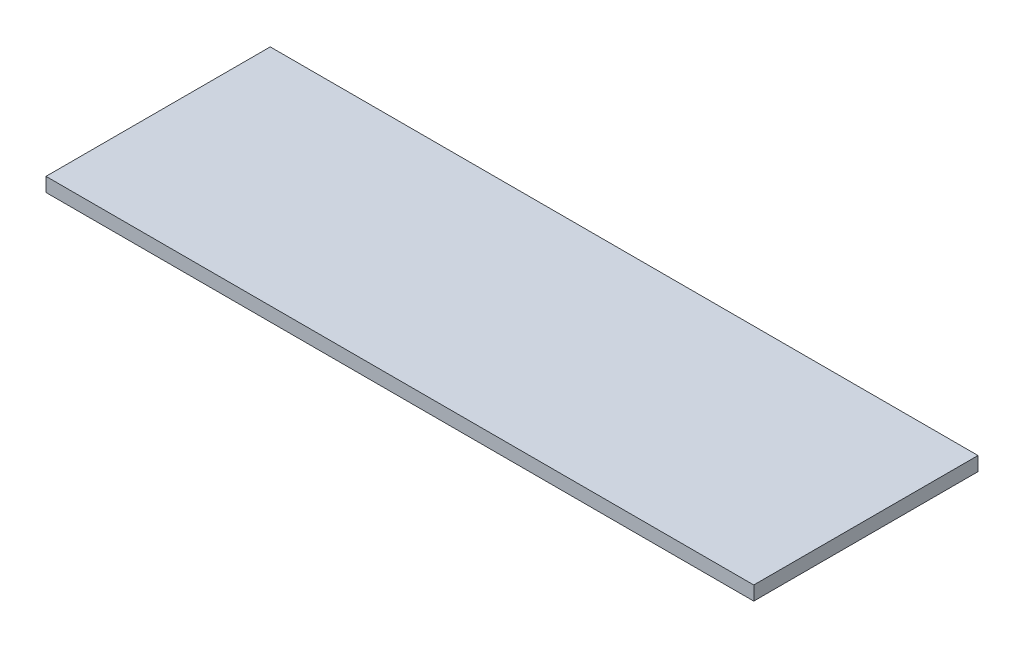
ISO-10303-21;
HEADER;
FILE_DESCRIPTION(('STEP AP214'),'2;1');
FILE_NAME('part.step','',(''),(''),'','','');
FILE_SCHEMA(('AUTOMOTIVE_DESIGN { 1 0 10303 214 1 1 1 1 }'));
ENDSEC;
DATA;
#1=APPLICATION_CONTEXT('core data for automotive mechanical design processes');
#2=APPLICATION_PROTOCOL_DEFINITION('international standard','automotive_design',2000,#1);
#3=PRODUCT_CONTEXT('',#1,'mechanical');
#4=PRODUCT('Part','Part','',(#3));
#5=PRODUCT_RELATED_PRODUCT_CATEGORY('part','',(#4));
#6=PRODUCT_DEFINITION_FORMATION('','',#4);
#7=PRODUCT_DEFINITION_CONTEXT('part definition',#1,'design');
#8=PRODUCT_DEFINITION('design','',#6,#7);
#9=PRODUCT_DEFINITION_SHAPE('','',#8);
#10=(LENGTH_UNIT() NAMED_UNIT(*) SI_UNIT(.MILLI.,.METRE.));
#11=(NAMED_UNIT(*) PLANE_ANGLE_UNIT() SI_UNIT($,.RADIAN.));
#12=(NAMED_UNIT(*) SI_UNIT($,.STERADIAN.) SOLID_ANGLE_UNIT());
#13=UNCERTAINTY_MEASURE_WITH_UNIT(LENGTH_MEASURE(1.E-05),#10,'distance_accuracy_value','');
#14=(GEOMETRIC_REPRESENTATION_CONTEXT(3) GLOBAL_UNCERTAINTY_ASSIGNED_CONTEXT((#13)) GLOBAL_UNIT_ASSIGNED_CONTEXT((#10,
#11,#12)) REPRESENTATION_CONTEXT('',''));
#15=CARTESIAN_POINT('',(0.,0.,0.));
#16=DIRECTION('',(0.,0.,1.));
#17=DIRECTION('',(1.,0.,0.));
#18=AXIS2_PLACEMENT_3D('',#15,#16,#17);
#19=CARTESIAN_POINT('',(0.,12.7,0.));
#20=DIRECTION('',(1.,0.,0.));
#21=DIRECTION('',(0.,0.,-1.));
#22=AXIS2_PLACEMENT_3D('',#19,#20,#21);
#23=PLANE('',#22);
#24=DIRECTION('',(0.,0.,1.));
#25=VECTOR('',#24,1.);
#26=CARTESIAN_POINT('',(0.,0.,0.));
#27=LINE('',#26,#25);
#28=CARTESIAN_POINT('',(0.,0.,-203.2));
#29=VERTEX_POINT('',#28);
#30=CARTESIAN_POINT('',(0.,0.,0.));
#31=VERTEX_POINT('',#30);
#32=EDGE_CURVE('E97',#29,#31,#27,.T.);
#33=ORIENTED_EDGE('',*,*,#32,.T.);
#34=DIRECTION('',(0.,-1.,0.));
#35=VECTOR('',#34,1.);
#36=CARTESIAN_POINT('',(0.,12.7,0.));
#37=LINE('',#36,#35);
#38=CARTESIAN_POINT('',(0.,12.7,0.));
#39=VERTEX_POINT('',#38);
#40=EDGE_CURVE('E11',#39,#31,#37,.T.);
#41=ORIENTED_EDGE('',*,*,#40,.F.);
#42=DIRECTION('',(0.,0.,1.));
#43=VECTOR('',#42,1.);
#44=CARTESIAN_POINT('',(0.,12.7,0.));
#45=LINE('',#44,#43);
#46=CARTESIAN_POINT('',(0.,12.7,-203.2));
#47=VERTEX_POINT('',#46);
#48=EDGE_CURVE('E85',#47,#39,#45,.T.);
#49=ORIENTED_EDGE('',*,*,#48,.F.);
#50=DIRECTION('',(0.,-1.,0.));
#51=VECTOR('',#50,1.);
#52=CARTESIAN_POINT('',(0.,12.7,-203.2));
#53=LINE('',#52,#51);
#54=EDGE_CURVE('E93',#47,#29,#53,.T.);
#55=ORIENTED_EDGE('',*,*,#54,.T.);
#56=EDGE_LOOP('',(#33,#41,#49,#55));
#57=FACE_BOUND('',#56,.T.);
#58=ADVANCED_FACE('F34',(#57),#23,.F.);
#59=CARTESIAN_POINT('',(0.,12.7,0.));
#60=DIRECTION('',(0.,0.,-1.));
#61=DIRECTION('',(-1.,0.,0.));
#62=AXIS2_PLACEMENT_3D('',#59,#60,#61);
#63=PLANE('',#62);
#64=DIRECTION('',(1.,0.,0.));
#65=VECTOR('',#64,1.);
#66=CARTESIAN_POINT('',(0.,0.,0.));
#67=LINE('',#66,#65);
#68=CARTESIAN_POINT('',(641.35,0.,0.));
#69=VERTEX_POINT('',#68);
#70=EDGE_CURVE('E89',#31,#69,#67,.T.);
#71=ORIENTED_EDGE('',*,*,#70,.T.);
#72=DIRECTION('',(0.,-1.,0.));
#73=VECTOR('',#72,1.);
#74=CARTESIAN_POINT('',(641.35,12.7,0.));
#75=LINE('',#74,#73);
#76=CARTESIAN_POINT('',(641.35,12.7,0.));
#77=VERTEX_POINT('',#76);
#78=EDGE_CURVE('E42',#77,#69,#75,.T.);
#79=ORIENTED_EDGE('',*,*,#78,.F.);
#80=DIRECTION('',(1.,0.,0.));
#81=VECTOR('',#80,1.);
#82=CARTESIAN_POINT('',(0.,12.7,0.));
#83=LINE('',#82,#81);
#84=EDGE_CURVE('E80',#39,#77,#83,.T.);
#85=ORIENTED_EDGE('',*,*,#84,.F.);
#86=ORIENTED_EDGE('',*,*,#40,.T.);
#87=EDGE_LOOP('',(#71,#79,#85,#86));
#88=FACE_BOUND('',#87,.T.);
#89=ADVANCED_FACE('F88',(#88),#63,.F.);
#90=CARTESIAN_POINT('',(641.35,12.7,0.));
#91=DIRECTION('',(-1.,0.,0.));
#92=DIRECTION('',(0.,0.,1.));
#93=AXIS2_PLACEMENT_3D('',#90,#91,#92);
#94=PLANE('',#93);
#95=DIRECTION('',(0.,0.,-1.));
#96=VECTOR('',#95,1.);
#97=CARTESIAN_POINT('',(641.35,0.,0.));
#98=LINE('',#97,#96);
#99=CARTESIAN_POINT('',(641.35,0.,-203.2));
#100=VERTEX_POINT('',#99);
#101=EDGE_CURVE('E67',#69,#100,#98,.T.);
#102=ORIENTED_EDGE('',*,*,#101,.T.);
#103=DIRECTION('',(0.,-1.,0.));
#104=VECTOR('',#103,1.);
#105=CARTESIAN_POINT('',(641.35,12.7,-203.2));
#106=LINE('',#105,#104);
#107=CARTESIAN_POINT('',(641.35,12.7,-203.2));
#108=VERTEX_POINT('',#107);
#109=EDGE_CURVE('E90',#108,#100,#106,.T.);
#110=ORIENTED_EDGE('',*,*,#109,.F.);
#111=DIRECTION('',(0.,0.,-1.));
#112=VECTOR('',#111,1.);
#113=CARTESIAN_POINT('',(641.35,12.7,0.));
#114=LINE('',#113,#112);
#115=EDGE_CURVE('E83',#77,#108,#114,.T.);
#116=ORIENTED_EDGE('',*,*,#115,.F.);
#117=ORIENTED_EDGE('',*,*,#78,.T.);
#118=EDGE_LOOP('',(#102,#110,#116,#117));
#119=FACE_BOUND('',#118,.T.);
#120=ADVANCED_FACE('F91',(#119),#94,.F.);
#121=CARTESIAN_POINT('',(0.,12.7,-203.2));
#122=DIRECTION('',(0.,0.,1.));
#123=DIRECTION('',(1.,0.,0.));
#124=AXIS2_PLACEMENT_3D('',#121,#122,#123);
#125=PLANE('',#124);
#126=DIRECTION('',(-1.,0.,0.));
#127=VECTOR('',#126,1.);
#128=CARTESIAN_POINT('',(0.,0.,-203.2));
#129=LINE('',#128,#127);
#130=EDGE_CURVE('E73',#100,#29,#129,.T.);
#131=ORIENTED_EDGE('',*,*,#130,.T.);
#132=ORIENTED_EDGE('',*,*,#54,.F.);
#133=DIRECTION('',(-1.,0.,0.));
#134=VECTOR('',#133,1.);
#135=CARTESIAN_POINT('',(0.,12.7,-203.2));
#136=LINE('',#135,#134);
#137=EDGE_CURVE('E50',#108,#47,#136,.T.);
#138=ORIENTED_EDGE('',*,*,#137,.F.);
#139=ORIENTED_EDGE('',*,*,#109,.T.);
#140=EDGE_LOOP('',(#131,#132,#138,#139));
#141=FACE_BOUND('',#140,.T.);
#142=ADVANCED_FACE('F104',(#141),#125,.F.);
#143=CARTESIAN_POINT('',(0.,12.7,0.));
#144=DIRECTION('',(0.,-1.,0.));
#145=DIRECTION('',(0.,0.,-1.));
#146=AXIS2_PLACEMENT_3D('',#143,#144,#145);
#147=PLANE('',#146);
#148=ORIENTED_EDGE('',*,*,#48,.T.);
#149=ORIENTED_EDGE('',*,*,#84,.T.);
#150=ORIENTED_EDGE('',*,*,#115,.T.);
#151=ORIENTED_EDGE('',*,*,#137,.T.);
#152=EDGE_LOOP('',(#148,#149,#150,#151));
#153=FACE_BOUND('',#152,.T.);
#154=ADVANCED_FACE('F81',(#153),#147,.F.);
#155=CARTESIAN_POINT('',(0.,0.,0.));
#156=DIRECTION('',(0.,-1.,0.));
#157=DIRECTION('',(0.,0.,-1.));
#158=AXIS2_PLACEMENT_3D('',#155,#156,#157);
#159=PLANE('',#158);
#160=ORIENTED_EDGE('',*,*,#32,.F.);
#161=ORIENTED_EDGE('',*,*,#130,.F.);
#162=ORIENTED_EDGE('',*,*,#101,.F.);
#163=ORIENTED_EDGE('',*,*,#70,.F.);
#164=EDGE_LOOP('',(#160,#161,#162,#163));
#165=FACE_BOUND('',#164,.T.);
#166=ADVANCED_FACE('F107',(#165),#159,.T.);
#167=CLOSED_SHELL('',(#58,#89,#120,#142,#154,#166));
#168=MANIFOLD_SOLID_BREP('B2',#167);
#169=ADVANCED_BREP_SHAPE_REPRESENTATION('',(#18,#168),#14);
#170=SHAPE_DEFINITION_REPRESENTATION(#9,#169);
ENDSEC;
END-ISO-10303-21;
